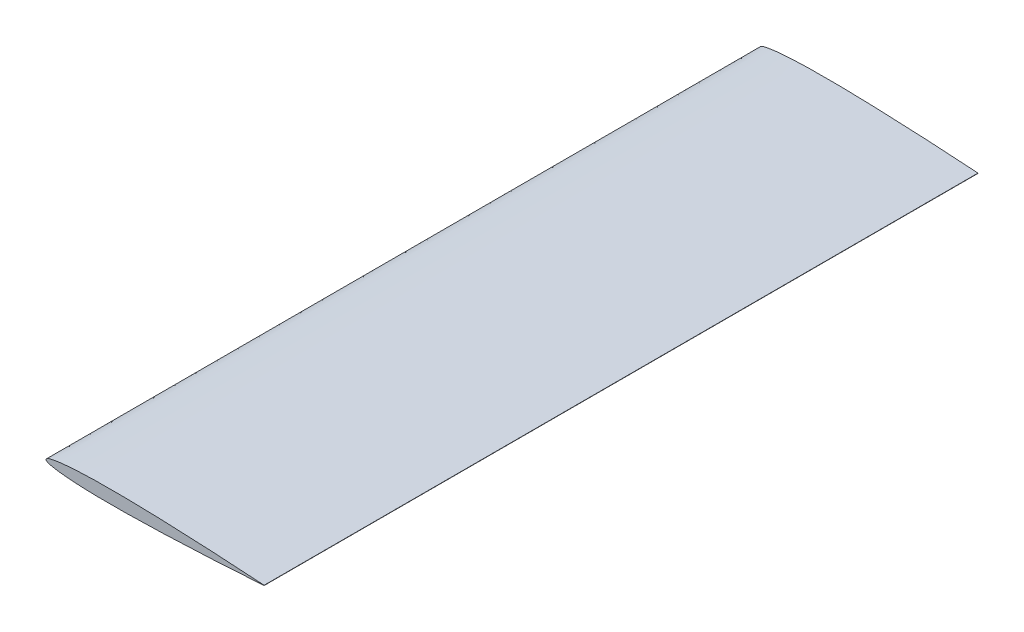
ISO-10303-21;
HEADER;
FILE_DESCRIPTION(('STEP AP214'),'2;1');
FILE_NAME('part.step','',(''),(''),'','','');
FILE_SCHEMA(('AUTOMOTIVE_DESIGN { 1 0 10303 214 1 1 1 1 }'));
ENDSEC;
DATA;
#1=APPLICATION_CONTEXT('core data for automotive mechanical design processes');
#2=APPLICATION_PROTOCOL_DEFINITION('international standard','automotive_design',2000,#1);
#3=PRODUCT_CONTEXT('',#1,'mechanical');
#4=PRODUCT('Part','Part','',(#3));
#5=PRODUCT_RELATED_PRODUCT_CATEGORY('part','',(#4));
#6=PRODUCT_DEFINITION_FORMATION('','',#4);
#7=PRODUCT_DEFINITION_CONTEXT('part definition',#1,'design');
#8=PRODUCT_DEFINITION('design','',#6,#7);
#9=PRODUCT_DEFINITION_SHAPE('','',#8);
#10=(LENGTH_UNIT() NAMED_UNIT(*) SI_UNIT(.MILLI.,.METRE.));
#11=(NAMED_UNIT(*) PLANE_ANGLE_UNIT() SI_UNIT($,.RADIAN.));
#12=(NAMED_UNIT(*) SI_UNIT($,.STERADIAN.) SOLID_ANGLE_UNIT());
#13=UNCERTAINTY_MEASURE_WITH_UNIT(LENGTH_MEASURE(1.E-05),#10,'distance_accuracy_value','');
#14=(GEOMETRIC_REPRESENTATION_CONTEXT(3) GLOBAL_UNCERTAINTY_ASSIGNED_CONTEXT((#13)) GLOBAL_UNIT_ASSIGNED_CONTEXT((#10,
#11,#12)) REPRESENTATION_CONTEXT('',''));
#15=CARTESIAN_POINT('',(0.,0.,0.));
#16=DIRECTION('',(0.,0.,1.));
#17=DIRECTION('',(1.,0.,0.));
#18=AXIS2_PLACEMENT_3D('',#15,#16,#17);
#19=CARTESIAN_POINT('',(2.76177129967429,-8.64943376214575,1371.6));
#20=CARTESIAN_POINT('',(-4.22285447048128,-8.16884949937262,1371.6));
#21=CARTESIAN_POINT('',(-18.1903594691232,-7.20780114639933,1371.6));
#22=CARTESIAN_POINT('',(-46.1279803942944,-5.42058051061947,1371.6));
#23=CARTESIAN_POINT('',(-81.0503680780225,-3.36783816415011,1371.6));
#24=CARTESIAN_POINT('',(-122.96121504452,-1.18914819280017,1371.6));
#25=CARTESIAN_POINT('',(-164.870944954926,0.70899989413781,1371.6));
#26=CARTESIAN_POINT('',(-206.781071477734,2.25374140456303,1371.6));
#27=CARTESIAN_POINT('',(-248.692140850491,3.35536477425465,1371.6));
#28=CARTESIAN_POINT('',(-283.622437248625,3.74011753635531,1371.6));
#29=CARTESIAN_POINT('',(-311.565387622964,3.58787289849234,1371.6));
#30=CARTESIAN_POINT('',(-332.522856479831,3.17422322953206,1371.6));
#31=CARTESIAN_POINT('',(-353.491269358138,2.37711047473015,1371.6));
#32=CARTESIAN_POINT('',(-370.943152347005,1.26916271140422,1371.6));
#33=CARTESIAN_POINT('',(-384.944272294383,-0.0717728473606338,1371.6));
#34=CARTESIAN_POINT('',(-395.350412272778,-1.33606564355447,1371.6));
#35=CARTESIAN_POINT('',(-404.420382517646,-3.07730330463597,1371.6));
#36=CARTESIAN_POINT('',(-411.069295145356,-4.61749519544413,1371.6));
#37=CARTESIAN_POINT('',(-419.218244093602,-8.91346676214605,1371.6));
#38=CARTESIAN_POINT('',(-411.069295145238,-13.2094383288509,1371.6));
#39=CARTESIAN_POINT('',(-404.420382517529,-14.7496302196559,1371.6));
#40=CARTESIAN_POINT('',(-395.350412272778,-16.4908678807355,1371.6));
#41=CARTESIAN_POINT('',(-384.944272294383,-17.7551606769312,1371.6));
#42=CARTESIAN_POINT('',(-370.943152347005,-19.0960962356905,1371.6));
#43=CARTESIAN_POINT('',(-353.491269358138,-20.2040439990201,1371.6));
#44=CARTESIAN_POINT('',(-332.52285647983,-21.001156753822,1371.6));
#45=CARTESIAN_POINT('',(-311.565387622964,-21.4148064227823,1371.6));
#46=CARTESIAN_POINT('',(-283.622437248625,-21.5670510606452,1371.6));
#47=CARTESIAN_POINT('',(-248.692140850491,-21.1822982985445,1371.6));
#48=CARTESIAN_POINT('',(-206.781071477734,-20.0806749288528,1371.6));
#49=CARTESIAN_POINT('',(-164.870944954926,-18.5359334184276,1371.6));
#50=CARTESIAN_POINT('',(-122.96121504452,-16.6377853314895,1371.6));
#51=CARTESIAN_POINT('',(-81.0503680780225,-14.4590953601396,1371.6));
#52=CARTESIAN_POINT('',(-46.1279803942944,-12.4063530136835,1371.6));
#53=CARTESIAN_POINT('',(-18.1903594691232,-10.6191323778921,1371.6));
#54=CARTESIAN_POINT('',(-4.22285447048128,-9.65808402491974,1371.6));
#55=CARTESIAN_POINT('',(2.76177129967429,-9.17749976214571,1371.6));
#56=B_SPLINE_CURVE_WITH_KNOTS('',3,(#19,#20,#21,#22,#23,#24,#25,#26,#27,#28,#29,#30,#31,#32,#33,
#34,#35,#36,#37,#38,#39,#40,#41,#42,#43,#44,#45,#46,#47,#48,#49,#50,#51,#52,#53,#54,#55),
.UNSPECIFIED.,.F.,.F.,(4,1,1,1,1,1,1,1,1,1,1,1,1,1,1,1,1,1,1,1,1,1,1,1,1,1,1,1,1,1,1,1,1,1,4),
(0.,0.0249245577594703,0.0498428830048284,0.0996630479535091,0.149464505803989,
0.199249098798805,0.249016479528594,0.298766909273868,0.348503608962617,0.373371187827416,
0.398243492902326,0.423129722742987,0.448051612806012,0.46054281715137,0.473079727808674,
0.485731111482558,0.492200581361296,0.5,0.507799418638703,0.514268888517442,0.526920272191325,
0.53945718284863,0.551948387193988,0.576870277257013,0.601756507097674,0.626628812172583,
0.651496391037383,0.701233090726132,0.750983520471406,0.800750901201195,0.850535494196011,
0.900336952046491,0.950157116995171,0.97507544224053,1.),.UNSPECIFIED.);
#57=DIRECTION('',(0.,0.,-1.));
#58=VECTOR('',#57,1.);
#59=SURFACE_OF_LINEAR_EXTRUSION('',#56,#58);
#60=CARTESIAN_POINT('',(2.76177129967429,-8.64943376214575,0.));
#61=CARTESIAN_POINT('',(-4.22285447048128,-8.16884949937262,0.));
#62=CARTESIAN_POINT('',(-18.1903594691232,-7.20780114639933,0.));
#63=CARTESIAN_POINT('',(-46.1279803942944,-5.42058051061947,0.));
#64=CARTESIAN_POINT('',(-81.0503680780225,-3.36783816415011,0.));
#65=CARTESIAN_POINT('',(-122.96121504452,-1.18914819280017,0.));
#66=CARTESIAN_POINT('',(-164.870944954926,0.70899989413781,0.));
#67=CARTESIAN_POINT('',(-206.781071477734,2.25374140456303,0.));
#68=CARTESIAN_POINT('',(-248.692140850491,3.35536477425465,0.));
#69=CARTESIAN_POINT('',(-283.622437248625,3.74011753635531,0.));
#70=CARTESIAN_POINT('',(-311.565387622964,3.58787289849234,0.));
#71=CARTESIAN_POINT('',(-332.522856479831,3.17422322953206,0.));
#72=CARTESIAN_POINT('',(-353.491269358138,2.37711047473015,0.));
#73=CARTESIAN_POINT('',(-370.943152347005,1.26916271140422,0.));
#74=CARTESIAN_POINT('',(-384.944272294383,-0.0717728473606338,0.));
#75=CARTESIAN_POINT('',(-395.350412272778,-1.33606564355447,0.));
#76=CARTESIAN_POINT('',(-404.420382517646,-3.07730330463597,0.));
#77=CARTESIAN_POINT('',(-411.069295145356,-4.61749519544413,0.));
#78=CARTESIAN_POINT('',(-419.218244093602,-8.91346676214605,0.));
#79=CARTESIAN_POINT('',(-411.069295145238,-13.2094383288509,0.));
#80=CARTESIAN_POINT('',(-404.420382517529,-14.7496302196559,0.));
#81=CARTESIAN_POINT('',(-395.350412272778,-16.4908678807355,0.));
#82=CARTESIAN_POINT('',(-384.944272294383,-17.7551606769312,0.));
#83=CARTESIAN_POINT('',(-370.943152347005,-19.0960962356905,0.));
#84=CARTESIAN_POINT('',(-353.491269358138,-20.2040439990201,0.));
#85=CARTESIAN_POINT('',(-332.52285647983,-21.001156753822,0.));
#86=CARTESIAN_POINT('',(-311.565387622964,-21.4148064227823,0.));
#87=CARTESIAN_POINT('',(-283.622437248625,-21.5670510606452,0.));
#88=CARTESIAN_POINT('',(-248.692140850491,-21.1822982985445,0.));
#89=CARTESIAN_POINT('',(-206.781071477734,-20.0806749288528,0.));
#90=CARTESIAN_POINT('',(-164.870944954926,-18.5359334184276,0.));
#91=CARTESIAN_POINT('',(-122.96121504452,-16.6377853314895,0.));
#92=CARTESIAN_POINT('',(-81.0503680780225,-14.4590953601396,0.));
#93=CARTESIAN_POINT('',(-46.1279803942944,-12.4063530136835,0.));
#94=CARTESIAN_POINT('',(-18.1903594691232,-10.6191323778921,0.));
#95=CARTESIAN_POINT('',(-4.22285447048128,-9.65808402491974,0.));
#96=CARTESIAN_POINT('',(2.76177129967429,-9.17749976214571,0.));
#97=B_SPLINE_CURVE_WITH_KNOTS('',3,(#60,#61,#62,#63,#64,#65,#66,#67,#68,#69,#70,#71,#72,#73,#74,
#75,#76,#77,#78,#79,#80,#81,#82,#83,#84,#85,#86,#87,#88,#89,#90,#91,#92,#93,#94,#95,#96),
.UNSPECIFIED.,.F.,.F.,(4,1,1,1,1,1,1,1,1,1,1,1,1,1,1,1,1,1,1,1,1,1,1,1,1,1,1,1,1,1,1,1,1,1,4),
(0.,0.0249245577594703,0.0498428830048284,0.0996630479535091,0.149464505803989,
0.199249098798805,0.249016479528594,0.298766909273868,0.348503608962617,0.373371187827416,
0.398243492902326,0.423129722742987,0.448051612806012,0.46054281715137,0.473079727808674,
0.485731111482558,0.492200581361296,0.5,0.507799418638703,0.514268888517442,0.526920272191325,
0.53945718284863,0.551948387193988,0.576870277257013,0.601756507097674,0.626628812172583,
0.651496391037383,0.701233090726132,0.750983520471406,0.800750901201195,0.850535494196011,
0.900336952046491,0.950157116995171,0.97507544224053,1.),.UNSPECIFIED.);
#98=CARTESIAN_POINT('',(2.7617712996743,-8.64943376214575,0.));
#99=VERTEX_POINT('',#98);
#100=CARTESIAN_POINT('',(2.7617712996743,-9.17749976214571,0.));
#101=VERTEX_POINT('',#100);
#102=EDGE_CURVE('E65',#99,#101,#97,.T.);
#103=ORIENTED_EDGE('',*,*,#102,.T.);
#104=DIRECTION('',(0.,0.,-1.));
#105=VECTOR('',#104,1.);
#106=CARTESIAN_POINT('',(2.7617712996743,-9.17749976214571,1371.6));
#107=LINE('',#106,#105);
#108=CARTESIAN_POINT('',(2.7617712996743,-9.17749976214571,1371.6));
#109=VERTEX_POINT('',#108);
#110=EDGE_CURVE('E11',#109,#101,#107,.T.);
#111=ORIENTED_EDGE('',*,*,#110,.F.);
#112=CARTESIAN_POINT('',(2.7617712996743,-8.64943376214575,1371.6));
#113=VERTEX_POINT('',#112);
#114=EDGE_CURVE('E64',#113,#109,#56,.T.);
#115=ORIENTED_EDGE('',*,*,#114,.F.);
#116=DIRECTION('',(0.,0.,-1.));
#117=VECTOR('',#116,1.);
#118=CARTESIAN_POINT('',(2.7617712996743,-8.64943376214575,1371.6));
#119=LINE('',#118,#117);
#120=EDGE_CURVE('E42',#113,#99,#119,.T.);
#121=ORIENTED_EDGE('',*,*,#120,.T.);
#122=EDGE_LOOP('',(#103,#111,#115,#121));
#123=FACE_BOUND('',#122,.T.);
#124=ADVANCED_FACE('F33',(#123),#59,.F.);
#125=CARTESIAN_POINT('',(2.7617712996743,-8.64943376214575,1371.6));
#126=DIRECTION('',(-1.,0.,0.));
#127=DIRECTION('',(0.,-1.,0.));
#128=AXIS2_PLACEMENT_3D('',#125,#126,#127);
#129=PLANE('',#128);
#130=DIRECTION('',(0.,1.,0.));
#131=VECTOR('',#130,1.);
#132=CARTESIAN_POINT('',(2.7617712996743,-8.64943376214575,0.));
#133=LINE('',#132,#131);
#134=EDGE_CURVE('E57',#101,#99,#133,.T.);
#135=ORIENTED_EDGE('',*,*,#134,.T.);
#136=ORIENTED_EDGE('',*,*,#120,.F.);
#137=DIRECTION('',(0.,1.,0.));
#138=VECTOR('',#137,1.);
#139=CARTESIAN_POINT('',(2.7617712996743,-8.64943376214575,1371.6));
#140=LINE('',#139,#138);
#141=EDGE_CURVE('E49',#109,#113,#140,.T.);
#142=ORIENTED_EDGE('',*,*,#141,.F.);
#143=ORIENTED_EDGE('',*,*,#110,.T.);
#144=EDGE_LOOP('',(#135,#136,#142,#143));
#145=FACE_BOUND('',#144,.T.);
#146=ADVANCED_FACE('F60',(#145),#129,.F.);
#147=CARTESIAN_POINT('',(-416.338228700326,-8.91346676214663,1371.6));
#148=DIRECTION('',(0.,0.,-1.));
#149=DIRECTION('',(-1.,0.,0.));
#150=AXIS2_PLACEMENT_3D('',#147,#148,#149);
#151=PLANE('',#150);
#152=ORIENTED_EDGE('',*,*,#114,.T.);
#153=ORIENTED_EDGE('',*,*,#141,.T.);
#154=EDGE_LOOP('',(#152,#153));
#155=FACE_BOUND('',#154,.T.);
#156=ADVANCED_FACE('F82',(#155),#151,.F.);
#157=CARTESIAN_POINT('',(-416.338228700326,-8.91346676214663,0.));
#158=DIRECTION('',(0.,0.,-1.));
#159=DIRECTION('',(-1.,0.,0.));
#160=AXIS2_PLACEMENT_3D('',#157,#158,#159);
#161=PLANE('',#160);
#162=ORIENTED_EDGE('',*,*,#102,.F.);
#163=ORIENTED_EDGE('',*,*,#134,.F.);
#164=EDGE_LOOP('',(#162,#163));
#165=FACE_BOUND('',#164,.T.);
#166=ADVANCED_FACE('F68',(#165),#161,.T.);
#167=CLOSED_SHELL('',(#124,#146,#156,#166));
#168=MANIFOLD_SOLID_BREP('B2',#167);
#169=ADVANCED_BREP_SHAPE_REPRESENTATION('',(#18,#168),#14);
#170=SHAPE_DEFINITION_REPRESENTATION(#9,#169);
ENDSEC;
END-ISO-10303-21;
